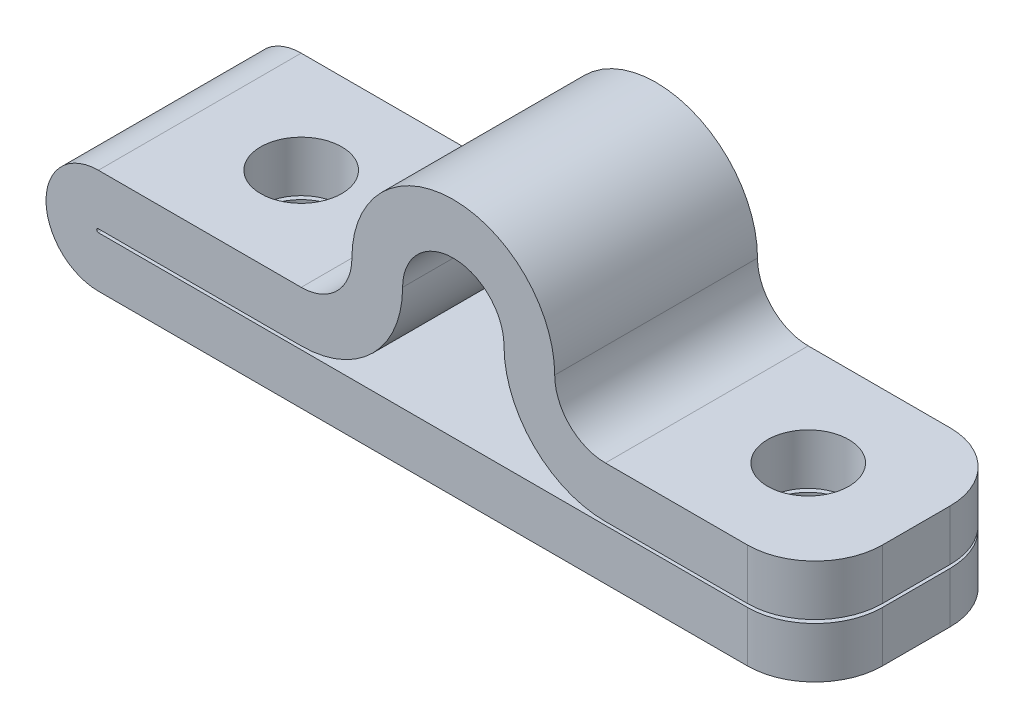
ISO-10303-21;
HEADER;
FILE_DESCRIPTION(('STEP AP214'),'2;1');
FILE_NAME('part.step','',(''),(''),'','','');
FILE_SCHEMA(('AUTOMOTIVE_DESIGN { 1 0 10303 214 1 1 1 1 }'));
ENDSEC;
DATA;
#1=APPLICATION_CONTEXT('core data for automotive mechanical design processes');
#2=APPLICATION_PROTOCOL_DEFINITION('international standard','automotive_design',2000,#1);
#3=PRODUCT_CONTEXT('',#1,'mechanical');
#4=PRODUCT('Part','Part','',(#3));
#5=PRODUCT_RELATED_PRODUCT_CATEGORY('part','',(#4));
#6=PRODUCT_DEFINITION_FORMATION('','',#4);
#7=PRODUCT_DEFINITION_CONTEXT('part definition',#1,'design');
#8=PRODUCT_DEFINITION('design','',#6,#7);
#9=PRODUCT_DEFINITION_SHAPE('','',#8);
#10=(LENGTH_UNIT() NAMED_UNIT(*) SI_UNIT(.MILLI.,.METRE.));
#11=(NAMED_UNIT(*) PLANE_ANGLE_UNIT() SI_UNIT($,.RADIAN.));
#12=(NAMED_UNIT(*) SI_UNIT($,.STERADIAN.) SOLID_ANGLE_UNIT());
#13=UNCERTAINTY_MEASURE_WITH_UNIT(LENGTH_MEASURE(1.E-05),#10,'distance_accuracy_value','');
#14=(GEOMETRIC_REPRESENTATION_CONTEXT(3) GLOBAL_UNCERTAINTY_ASSIGNED_CONTEXT((#13)) GLOBAL_UNIT_ASSIGNED_CONTEXT((#10,
#11,#12)) REPRESENTATION_CONTEXT('',''));
#15=CARTESIAN_POINT('',(0.,0.,0.));
#16=DIRECTION('',(0.,0.,1.));
#17=DIRECTION('',(1.,0.,0.));
#18=AXIS2_PLACEMENT_3D('',#15,#16,#17);
#19=CARTESIAN_POINT('',(4.5,4.6,3.));
#20=DIRECTION('',(0.,0.,-1.));
#21=DIRECTION('',(-1.,0.,0.));
#22=AXIS2_PLACEMENT_3D('',#19,#20,#21);
#23=CYLINDRICAL_SURFACE('',#22,1.5);
#24=CARTESIAN_POINT('',(4.5,4.6,-3.));
#25=DIRECTION('',(0.,0.,1.));
#26=DIRECTION('',(1.,0.,0.));
#27=AXIS2_PLACEMENT_3D('',#24,#25,#26);
#28=CIRCLE('',#27,1.5);
#29=CARTESIAN_POINT('',(4.5,3.1,-3.));
#30=VERTEX_POINT('',#29);
#31=CARTESIAN_POINT('',(3.,4.6,-3.));
#32=VERTEX_POINT('',#31);
#33=EDGE_CURVE('E206',#30,#32,#28,.F.);
#34=ORIENTED_EDGE('',*,*,#33,.T.);
#35=DIRECTION('',(0.,0.,-1.));
#36=VECTOR('',#35,1.);
#37=CARTESIAN_POINT('',(3.,4.6,3.));
#38=LINE('',#37,#36);
#39=CARTESIAN_POINT('',(3.,4.6,3.));
#40=VERTEX_POINT('',#39);
#41=EDGE_CURVE('E187',#40,#32,#38,.T.);
#42=ORIENTED_EDGE('',*,*,#41,.F.);
#43=CARTESIAN_POINT('',(4.5,4.6,3.));
#44=DIRECTION('',(0.,0.,1.));
#45=DIRECTION('',(1.,0.,0.));
#46=AXIS2_PLACEMENT_3D('',#43,#44,#45);
#47=CIRCLE('',#46,1.5);
#48=CARTESIAN_POINT('',(4.5,3.1,3.));
#49=VERTEX_POINT('',#48);
#50=EDGE_CURVE('E194',#49,#40,#47,.F.);
#51=ORIENTED_EDGE('',*,*,#50,.F.);
#52=DIRECTION('',(0.,0.,-1.));
#53=VECTOR('',#52,1.);
#54=CARTESIAN_POINT('',(4.5,3.1,3.));
#55=LINE('',#54,#53);
#56=EDGE_CURVE('E278',#49,#30,#55,.T.);
#57=ORIENTED_EDGE('',*,*,#56,.T.);
#58=EDGE_LOOP('',(#34,#42,#51,#57));
#59=FACE_BOUND('',#58,.T.);
#60=ADVANCED_FACE('F43',(#59),#23,.F.);
#61=CARTESIAN_POINT('',(0.,4.6,3.));
#62=DIRECTION('',(0.,0.,-1.));
#63=DIRECTION('',(-1.,0.,0.));
#64=AXIS2_PLACEMENT_3D('',#61,#62,#63);
#65=CYLINDRICAL_SURFACE('',#64,3.);
#66=CARTESIAN_POINT('',(0.,4.6,-3.));
#67=DIRECTION('',(0.,0.,1.));
#68=DIRECTION('',(1.,0.,0.));
#69=AXIS2_PLACEMENT_3D('',#66,#67,#68);
#70=CIRCLE('',#69,3.);
#71=CARTESIAN_POINT('',(-3.,4.6,-3.));
#72=VERTEX_POINT('',#71);
#73=EDGE_CURVE('E280',#32,#72,#70,.T.);
#74=ORIENTED_EDGE('',*,*,#73,.T.);
#75=DIRECTION('',(0.,0.,-1.));
#76=VECTOR('',#75,1.);
#77=CARTESIAN_POINT('',(-3.,4.6,3.));
#78=LINE('',#77,#76);
#79=CARTESIAN_POINT('',(-3.,4.6,3.));
#80=VERTEX_POINT('',#79);
#81=EDGE_CURVE('E189',#80,#72,#78,.T.);
#82=ORIENTED_EDGE('',*,*,#81,.F.);
#83=CARTESIAN_POINT('',(0.,4.6,3.));
#84=DIRECTION('',(0.,0.,1.));
#85=DIRECTION('',(1.,0.,0.));
#86=AXIS2_PLACEMENT_3D('',#83,#84,#85);
#87=CIRCLE('',#86,3.);
#88=EDGE_CURVE('E182',#40,#80,#87,.T.);
#89=ORIENTED_EDGE('',*,*,#88,.F.);
#90=ORIENTED_EDGE('',*,*,#41,.T.);
#91=EDGE_LOOP('',(#74,#82,#89,#90));
#92=FACE_BOUND('',#91,.T.);
#93=ADVANCED_FACE('F185',(#92),#65,.T.);
#94=CARTESIAN_POINT('',(-4.5,4.6,3.));
#95=DIRECTION('',(0.,0.,-1.));
#96=DIRECTION('',(-1.,0.,0.));
#97=AXIS2_PLACEMENT_3D('',#94,#95,#96);
#98=CYLINDRICAL_SURFACE('',#97,1.5);
#99=CARTESIAN_POINT('',(-4.5,4.6,-3.));
#100=DIRECTION('',(0.,0.,1.));
#101=DIRECTION('',(1.,0.,0.));
#102=AXIS2_PLACEMENT_3D('',#99,#100,#101);
#103=CIRCLE('',#102,1.5);
#104=CARTESIAN_POINT('',(-4.5,3.1,-3.));
#105=VERTEX_POINT('',#104);
#106=EDGE_CURVE('E283',#105,#72,#103,.T.);
#107=ORIENTED_EDGE('',*,*,#106,.F.);
#108=DIRECTION('',(0.,0.,-1.));
#109=VECTOR('',#108,1.);
#110=CARTESIAN_POINT('',(-4.5,3.1,3.));
#111=LINE('',#110,#109);
#112=CARTESIAN_POINT('',(-4.5,3.1,3.));
#113=VERTEX_POINT('',#112);
#114=EDGE_CURVE('E211',#113,#105,#111,.T.);
#115=ORIENTED_EDGE('',*,*,#114,.F.);
#116=CARTESIAN_POINT('',(-4.5,4.6,3.));
#117=DIRECTION('',(0.,0.,1.));
#118=DIRECTION('',(1.,0.,0.));
#119=AXIS2_PLACEMENT_3D('',#116,#117,#118);
#120=CIRCLE('',#119,1.5);
#121=EDGE_CURVE('E193',#113,#80,#120,.T.);
#122=ORIENTED_EDGE('',*,*,#121,.T.);
#123=ORIENTED_EDGE('',*,*,#81,.T.);
#124=EDGE_LOOP('',(#107,#115,#122,#123));
#125=FACE_BOUND('',#124,.T.);
#126=ADVANCED_FACE('F350',(#125),#98,.F.);
#127=CARTESIAN_POINT('',(0.,3.1,3.));
#128=DIRECTION('',(0.,1.,0.));
#129=DIRECTION('',(0.,0.,1.));
#130=AXIS2_PLACEMENT_3D('',#127,#128,#129);
#131=PLANE('',#130);
#132=CARTESIAN_POINT('',(-7.5,3.1,0.));
#133=DIRECTION('',(0.,1.,0.));
#134=DIRECTION('',(0.,0.,1.));
#135=AXIS2_PLACEMENT_3D('',#132,#133,#134);
#136=CIRCLE('',#135,1.19999999999999);
#137=CARTESIAN_POINT('',(-7.5,3.1,1.19999999999999));
#138=VERTEX_POINT('',#137);
#139=EDGE_CURVE('E382',#138,#138,#136,.T.);
#140=ORIENTED_EDGE('',*,*,#139,.F.);
#141=EDGE_LOOP('',(#140));
#142=FACE_BOUND('',#141,.T.);
#143=DIRECTION('',(1.,0.,0.));
#144=VECTOR('',#143,1.);
#145=CARTESIAN_POINT('',(0.,3.1,-3.));
#146=LINE('',#145,#144);
#147=CARTESIAN_POINT('',(-10.5,3.1,-3.));
#148=VERTEX_POINT('',#147);
#149=EDGE_CURVE('E286',#148,#105,#146,.T.);
#150=ORIENTED_EDGE('',*,*,#149,.F.);
#151=DIRECTION('',(0.,0.,-1.));
#152=VECTOR('',#151,1.);
#153=CARTESIAN_POINT('',(-10.5,3.1,3.));
#154=LINE('',#153,#152);
#155=CARTESIAN_POINT('',(-10.5,3.1,3.));
#156=VERTEX_POINT('',#155);
#157=EDGE_CURVE('E341',#156,#148,#154,.T.);
#158=ORIENTED_EDGE('',*,*,#157,.F.);
#159=DIRECTION('',(1.,0.,0.));
#160=VECTOR('',#159,1.);
#161=CARTESIAN_POINT('',(0.,3.1,3.));
#162=LINE('',#161,#160);
#163=EDGE_CURVE('E348',#156,#113,#162,.T.);
#164=ORIENTED_EDGE('',*,*,#163,.T.);
#165=ORIENTED_EDGE('',*,*,#114,.T.);
#166=EDGE_LOOP('',(#150,#158,#164,#165));
#167=FACE_BOUND('',#166,.T.);
#168=ADVANCED_FACE('F346',(#142,#167),#131,.T.);
#169=CARTESIAN_POINT('',(-10.5,1.55,3.));
#170=DIRECTION('',(0.,0.,-1.));
#171=DIRECTION('',(-1.,0.,0.));
#172=AXIS2_PLACEMENT_3D('',#169,#170,#171);
#173=CYLINDRICAL_SURFACE('',#172,1.55);
#174=CARTESIAN_POINT('',(-10.5,1.55,-3.));
#175=DIRECTION('',(0.,0.,1.));
#176=DIRECTION('',(1.,0.,0.));
#177=AXIS2_PLACEMENT_3D('',#174,#175,#176);
#178=CIRCLE('',#177,1.55);
#179=CARTESIAN_POINT('',(-10.5,0.,-3.));
#180=VERTEX_POINT('',#179);
#181=EDGE_CURVE('E289',#180,#148,#178,.F.);
#182=ORIENTED_EDGE('',*,*,#181,.F.);
#183=DIRECTION('',(0.,0.,-1.));
#184=VECTOR('',#183,1.);
#185=CARTESIAN_POINT('',(-10.5,0.,3.));
#186=LINE('',#185,#184);
#187=CARTESIAN_POINT('',(-10.5,0.,3.));
#188=VERTEX_POINT('',#187);
#189=EDGE_CURVE('E339',#188,#180,#186,.T.);
#190=ORIENTED_EDGE('',*,*,#189,.F.);
#191=CARTESIAN_POINT('',(-10.5,1.55,3.));
#192=DIRECTION('',(0.,0.,1.));
#193=DIRECTION('',(1.,0.,0.));
#194=AXIS2_PLACEMENT_3D('',#191,#192,#193);
#195=CIRCLE('',#194,1.55);
#196=EDGE_CURVE('E261',#188,#156,#195,.F.);
#197=ORIENTED_EDGE('',*,*,#196,.T.);
#198=ORIENTED_EDGE('',*,*,#157,.T.);
#199=EDGE_LOOP('',(#182,#190,#197,#198));
#200=FACE_BOUND('',#199,.T.);
#201=ADVANCED_FACE('F357',(#200),#173,.T.);
#202=CARTESIAN_POINT('',(0.,0.,3.));
#203=DIRECTION('',(0.,1.,0.));
#204=DIRECTION('',(0.,0.,1.));
#205=AXIS2_PLACEMENT_3D('',#202,#203,#204);
#206=PLANE('',#205);
#207=CARTESIAN_POINT('',(-7.5,0.,0.));
#208=DIRECTION('',(0.,1.,0.));
#209=DIRECTION('',(0.,0.,1.));
#210=AXIS2_PLACEMENT_3D('',#207,#208,#209);
#211=CIRCLE('',#210,1.2);
#212=CARTESIAN_POINT('',(-7.5,0.,1.2));
#213=VERTEX_POINT('',#212);
#214=EDGE_CURVE('E379',#213,#213,#211,.T.);
#215=ORIENTED_EDGE('',*,*,#214,.T.);
#216=EDGE_LOOP('',(#215));
#217=FACE_BOUND('',#216,.T.);
#218=CARTESIAN_POINT('',(7.5,0.,0.));
#219=DIRECTION('',(0.,1.,0.));
#220=DIRECTION('',(0.,0.,1.));
#221=AXIS2_PLACEMENT_3D('',#218,#219,#220);
#222=CIRCLE('',#221,1.2);
#223=CARTESIAN_POINT('',(7.5,0.,1.2));
#224=VERTEX_POINT('',#223);
#225=EDGE_CURVE('E367',#224,#224,#222,.T.);
#226=ORIENTED_EDGE('',*,*,#225,.T.);
#227=EDGE_LOOP('',(#226));
#228=FACE_BOUND('',#227,.T.);
#229=DIRECTION('',(1.,0.,0.));
#230=VECTOR('',#229,1.);
#231=CARTESIAN_POINT('',(0.,0.,-3.));
#232=LINE('',#231,#230);
#233=CARTESIAN_POINT('',(8.7,0.,-3.));
#234=VERTEX_POINT('',#233);
#235=EDGE_CURVE('E292',#180,#234,#232,.T.);
#236=ORIENTED_EDGE('',*,*,#235,.T.);
#237=CARTESIAN_POINT('',(8.7,0.,-1.));
#238=DIRECTION('',(0.,1.,0.));
#239=DIRECTION('',(0.,0.,1.));
#240=AXIS2_PLACEMENT_3D('',#237,#238,#239);
#241=CIRCLE('',#240,2.);
#242=CARTESIAN_POINT('',(10.7,0.,-1.));
#243=VERTEX_POINT('',#242);
#244=EDGE_CURVE('E227',#234,#243,#241,.F.);
#245=ORIENTED_EDGE('',*,*,#244,.T.);
#246=DIRECTION('',(0.,0.,-1.));
#247=VECTOR('',#246,1.);
#248=CARTESIAN_POINT('',(10.7,0.,3.));
#249=LINE('',#248,#247);
#250=CARTESIAN_POINT('',(10.7,0.,1.));
#251=VERTEX_POINT('',#250);
#252=EDGE_CURVE('E336',#251,#243,#249,.T.);
#253=ORIENTED_EDGE('',*,*,#252,.F.);
#254=CARTESIAN_POINT('',(8.7,0.,1.));
#255=DIRECTION('',(0.,1.,0.));
#256=DIRECTION('',(0.,0.,1.));
#257=AXIS2_PLACEMENT_3D('',#254,#255,#256);
#258=CIRCLE('',#257,2.);
#259=CARTESIAN_POINT('',(8.7,0.,3.));
#260=VERTEX_POINT('',#259);
#261=EDGE_CURVE('E225',#251,#260,#258,.F.);
#262=ORIENTED_EDGE('',*,*,#261,.T.);
#263=DIRECTION('',(1.,0.,0.));
#264=VECTOR('',#263,1.);
#265=CARTESIAN_POINT('',(0.,0.,3.));
#266=LINE('',#265,#264);
#267=EDGE_CURVE('E247',#188,#260,#266,.T.);
#268=ORIENTED_EDGE('',*,*,#267,.F.);
#269=ORIENTED_EDGE('',*,*,#189,.T.);
#270=EDGE_LOOP('',(#236,#245,#253,#262,#268,#269));
#271=FACE_BOUND('',#270,.T.);
#272=ADVANCED_FACE('F396',(#217,#228,#271),#206,.F.);
#273=CARTESIAN_POINT('',(10.7,0.,3.));
#274=DIRECTION('',(-1.,0.,0.));
#275=DIRECTION('',(0.,0.,1.));
#276=AXIS2_PLACEMENT_3D('',#273,#274,#275);
#277=PLANE('',#276);
#278=ORIENTED_EDGE('',*,*,#252,.T.);
#279=DIRECTION('',(0.,1.,0.));
#280=VECTOR('',#279,1.);
#281=CARTESIAN_POINT('',(10.7,0.,-1.));
#282=LINE('',#281,#280);
#283=CARTESIAN_POINT('',(10.7,1.5,-1.));
#284=VERTEX_POINT('',#283);
#285=EDGE_CURVE('E209',#243,#284,#282,.T.);
#286=ORIENTED_EDGE('',*,*,#285,.T.);
#287=DIRECTION('',(0.,0.,-1.));
#288=VECTOR('',#287,1.);
#289=CARTESIAN_POINT('',(10.7,1.5,3.));
#290=LINE('',#289,#288);
#291=CARTESIAN_POINT('',(10.7,1.5,1.));
#292=VERTEX_POINT('',#291);
#293=EDGE_CURVE('E334',#292,#284,#290,.T.);
#294=ORIENTED_EDGE('',*,*,#293,.F.);
#295=DIRECTION('',(0.,1.,0.));
#296=VECTOR('',#295,1.);
#297=CARTESIAN_POINT('',(10.7,0.,1.));
#298=LINE('',#297,#296);
#299=EDGE_CURVE('E207',#292,#251,#298,.F.);
#300=ORIENTED_EDGE('',*,*,#299,.T.);
#301=EDGE_LOOP('',(#278,#286,#294,#300));
#302=FACE_BOUND('',#301,.T.);
#303=ADVANCED_FACE('F463',(#302),#277,.F.);
#304=CARTESIAN_POINT('',(0.,1.5,3.));
#305=DIRECTION('',(0.,-1.,0.));
#306=DIRECTION('',(1.,0.,0.));
#307=AXIS2_PLACEMENT_3D('',#304,#305,#306);
#308=PLANE('',#307);
#309=CARTESIAN_POINT('',(-7.5,1.5,0.));
#310=DIRECTION('',(0.,-1.,0.));
#311=DIRECTION('',(1.,0.,0.));
#312=AXIS2_PLACEMENT_3D('',#309,#310,#311);
#313=CIRCLE('',#312,1.19999999999999);
#314=CARTESIAN_POINT('',(-6.30000000000001,1.5,0.));
#315=VERTEX_POINT('',#314);
#316=EDGE_CURVE('E376',#315,#315,#313,.T.);
#317=ORIENTED_EDGE('',*,*,#316,.T.);
#318=EDGE_LOOP('',(#317));
#319=FACE_BOUND('',#318,.T.);
#320=CARTESIAN_POINT('',(7.5,1.5,0.));
#321=DIRECTION('',(0.,-1.,0.));
#322=DIRECTION('',(1.,0.,0.));
#323=AXIS2_PLACEMENT_3D('',#320,#321,#322);
#324=CIRCLE('',#323,1.19999999999999);
#325=CARTESIAN_POINT('',(8.7,1.5,0.));
#326=VERTEX_POINT('',#325);
#327=EDGE_CURVE('E364',#326,#326,#324,.T.);
#328=ORIENTED_EDGE('',*,*,#327,.T.);
#329=EDGE_LOOP('',(#328));
#330=FACE_BOUND('',#329,.T.);
#331=ORIENTED_EDGE('',*,*,#293,.T.);
#332=CARTESIAN_POINT('',(8.7,1.5,-1.));
#333=DIRECTION('',(0.,-1.,0.));
#334=DIRECTION('',(1.,0.,0.));
#335=AXIS2_PLACEMENT_3D('',#332,#333,#334);
#336=CIRCLE('',#335,2.);
#337=CARTESIAN_POINT('',(8.7,1.5,-3.));
#338=VERTEX_POINT('',#337);
#339=EDGE_CURVE('E219',#284,#338,#336,.F.);
#340=ORIENTED_EDGE('',*,*,#339,.T.);
#341=DIRECTION('',(-1.,0.,0.));
#342=VECTOR('',#341,1.);
#343=CARTESIAN_POINT('',(0.,1.5,-3.));
#344=LINE('',#343,#342);
#345=CARTESIAN_POINT('',(-10.5,1.5,-3.));
#346=VERTEX_POINT('',#345);
#347=EDGE_CURVE('E295',#338,#346,#344,.T.);
#348=ORIENTED_EDGE('',*,*,#347,.T.);
#349=DIRECTION('',(0.,0.,-1.));
#350=VECTOR('',#349,1.);
#351=CARTESIAN_POINT('',(-10.5,1.5,3.));
#352=LINE('',#351,#350);
#353=CARTESIAN_POINT('',(-10.5,1.5,3.));
#354=VERTEX_POINT('',#353);
#355=EDGE_CURVE('E255',#354,#346,#352,.T.);
#356=ORIENTED_EDGE('',*,*,#355,.F.);
#357=DIRECTION('',(-1.,0.,0.));
#358=VECTOR('',#357,1.);
#359=CARTESIAN_POINT('',(0.,1.5,3.));
#360=LINE('',#359,#358);
#361=CARTESIAN_POINT('',(8.7,1.5,3.));
#362=VERTEX_POINT('',#361);
#363=EDGE_CURVE('E243',#362,#354,#360,.T.);
#364=ORIENTED_EDGE('',*,*,#363,.F.);
#365=CARTESIAN_POINT('',(8.7,1.5,1.));
#366=DIRECTION('',(0.,-1.,0.));
#367=DIRECTION('',(1.,0.,0.));
#368=AXIS2_PLACEMENT_3D('',#365,#366,#367);
#369=CIRCLE('',#368,2.);
#370=EDGE_CURVE('E217',#362,#292,#369,.F.);
#371=ORIENTED_EDGE('',*,*,#370,.T.);
#372=EDGE_LOOP('',(#331,#340,#348,#356,#364,#371));
#373=FACE_BOUND('',#372,.T.);
#374=ADVANCED_FACE('F252',(#319,#330,#373),#308,.F.);
#375=CARTESIAN_POINT('',(-10.5,1.55,3.));
#376=DIRECTION('',(0.,0.,-1.));
#377=DIRECTION('',(-1.,0.,0.));
#378=AXIS2_PLACEMENT_3D('',#375,#376,#377);
#379=CYLINDRICAL_SURFACE('',#378,0.050000000000001);
#380=CARTESIAN_POINT('',(-10.5,1.55,-3.));
#381=DIRECTION('',(0.,0.,1.));
#382=DIRECTION('',(1.,0.,0.));
#383=AXIS2_PLACEMENT_3D('',#380,#381,#382);
#384=CIRCLE('',#383,0.050000000000001);
#385=CARTESIAN_POINT('',(-10.5,1.6,-3.));
#386=VERTEX_POINT('',#385);
#387=EDGE_CURVE('E297',#346,#386,#384,.F.);
#388=ORIENTED_EDGE('',*,*,#387,.T.);
#389=DIRECTION('',(0.,0.,-1.));
#390=VECTOR('',#389,1.);
#391=CARTESIAN_POINT('',(-10.5,1.6,3.));
#392=LINE('',#391,#390);
#393=CARTESIAN_POINT('',(-10.5,1.6,3.));
#394=VERTEX_POINT('',#393);
#395=EDGE_CURVE('E330',#394,#386,#392,.T.);
#396=ORIENTED_EDGE('',*,*,#395,.F.);
#397=CARTESIAN_POINT('',(-10.5,1.55,3.));
#398=DIRECTION('',(0.,0.,1.));
#399=DIRECTION('',(1.,0.,0.));
#400=AXIS2_PLACEMENT_3D('',#397,#398,#399);
#401=CIRCLE('',#400,0.050000000000001);
#402=EDGE_CURVE('E257',#354,#394,#401,.F.);
#403=ORIENTED_EDGE('',*,*,#402,.F.);
#404=ORIENTED_EDGE('',*,*,#355,.T.);
#405=EDGE_LOOP('',(#388,#396,#403,#404));
#406=FACE_BOUND('',#405,.T.);
#407=ADVANCED_FACE('F456',(#406),#379,.F.);
#408=CARTESIAN_POINT('',(0.,1.6,3.));
#409=DIRECTION('',(0.,1.,0.));
#410=DIRECTION('',(0.,0.,1.));
#411=AXIS2_PLACEMENT_3D('',#408,#409,#410);
#412=PLANE('',#411);
#413=CARTESIAN_POINT('',(-7.5,1.6,0.));
#414=DIRECTION('',(0.,1.,0.));
#415=DIRECTION('',(0.,0.,1.));
#416=AXIS2_PLACEMENT_3D('',#413,#414,#415);
#417=CIRCLE('',#416,1.19999999999999);
#418=CARTESIAN_POINT('',(-7.5,1.6,1.19999999999999));
#419=VERTEX_POINT('',#418);
#420=EDGE_CURVE('E373',#419,#419,#417,.T.);
#421=ORIENTED_EDGE('',*,*,#420,.T.);
#422=EDGE_LOOP('',(#421));
#423=FACE_BOUND('',#422,.T.);
#424=DIRECTION('',(1.,0.,0.));
#425=VECTOR('',#424,1.);
#426=CARTESIAN_POINT('',(0.,1.6,-3.));
#427=LINE('',#426,#425);
#428=CARTESIAN_POINT('',(-4.5,1.6,-3.));
#429=VERTEX_POINT('',#428);
#430=EDGE_CURVE('E299',#386,#429,#427,.T.);
#431=ORIENTED_EDGE('',*,*,#430,.T.);
#432=DIRECTION('',(0.,0.,-1.));
#433=VECTOR('',#432,1.);
#434=CARTESIAN_POINT('',(-4.5,1.6,3.));
#435=LINE('',#434,#433);
#436=CARTESIAN_POINT('',(-4.5,1.6,3.));
#437=VERTEX_POINT('',#436);
#438=EDGE_CURVE('E328',#437,#429,#435,.T.);
#439=ORIENTED_EDGE('',*,*,#438,.F.);
#440=DIRECTION('',(1.,0.,0.));
#441=VECTOR('',#440,1.);
#442=CARTESIAN_POINT('',(0.,1.6,3.));
#443=LINE('',#442,#441);
#444=EDGE_CURVE('E259',#394,#437,#443,.T.);
#445=ORIENTED_EDGE('',*,*,#444,.F.);
#446=ORIENTED_EDGE('',*,*,#395,.T.);
#447=EDGE_LOOP('',(#431,#439,#445,#446));
#448=FACE_BOUND('',#447,.T.);
#449=ADVANCED_FACE('F453',(#423,#448),#412,.F.);
#450=CARTESIAN_POINT('',(-4.5,4.6,3.));
#451=DIRECTION('',(0.,0.,-1.));
#452=DIRECTION('',(-1.,0.,0.));
#453=AXIS2_PLACEMENT_3D('',#450,#451,#452);
#454=CYLINDRICAL_SURFACE('',#453,3.);
#455=CARTESIAN_POINT('',(-4.5,4.6,-3.));
#456=DIRECTION('',(0.,0.,1.));
#457=DIRECTION('',(1.,0.,0.));
#458=AXIS2_PLACEMENT_3D('',#455,#456,#457);
#459=CIRCLE('',#458,3.);
#460=CARTESIAN_POINT('',(-1.5,4.6,-3.));
#461=VERTEX_POINT('',#460);
#462=EDGE_CURVE('E302',#461,#429,#459,.F.);
#463=ORIENTED_EDGE('',*,*,#462,.F.);
#464=DIRECTION('',(0.,0.,-1.));
#465=VECTOR('',#464,1.);
#466=CARTESIAN_POINT('',(-1.5,4.6,3.));
#467=LINE('',#466,#465);
#468=CARTESIAN_POINT('',(-1.5,4.6,3.));
#469=VERTEX_POINT('',#468);
#470=EDGE_CURVE('E326',#469,#461,#467,.T.);
#471=ORIENTED_EDGE('',*,*,#470,.F.);
#472=CARTESIAN_POINT('',(-4.5,4.6,3.));
#473=DIRECTION('',(0.,0.,1.));
#474=DIRECTION('',(1.,0.,0.));
#475=AXIS2_PLACEMENT_3D('',#472,#473,#474);
#476=CIRCLE('',#475,3.);
#477=EDGE_CURVE('E266',#469,#437,#476,.F.);
#478=ORIENTED_EDGE('',*,*,#477,.T.);
#479=ORIENTED_EDGE('',*,*,#438,.T.);
#480=EDGE_LOOP('',(#463,#471,#478,#479));
#481=FACE_BOUND('',#480,.T.);
#482=ADVANCED_FACE('F449',(#481),#454,.T.);
#483=CARTESIAN_POINT('',(0.,4.6,3.));
#484=DIRECTION('',(0.,0.,-1.));
#485=DIRECTION('',(-1.,0.,0.));
#486=AXIS2_PLACEMENT_3D('',#483,#484,#485);
#487=CYLINDRICAL_SURFACE('',#486,1.5);
#488=CARTESIAN_POINT('',(0.,4.6,-3.));
#489=DIRECTION('',(0.,0.,1.));
#490=DIRECTION('',(1.,0.,0.));
#491=AXIS2_PLACEMENT_3D('',#488,#489,#490);
#492=CIRCLE('',#491,1.5);
#493=CARTESIAN_POINT('',(1.5,4.6,-3.));
#494=VERTEX_POINT('',#493);
#495=EDGE_CURVE('E305',#494,#461,#492,.T.);
#496=ORIENTED_EDGE('',*,*,#495,.F.);
#497=DIRECTION('',(0.,0.,-1.));
#498=VECTOR('',#497,1.);
#499=CARTESIAN_POINT('',(1.5,4.6,3.));
#500=LINE('',#499,#498);
#501=CARTESIAN_POINT('',(1.5,4.6,3.));
#502=VERTEX_POINT('',#501);
#503=EDGE_CURVE('E324',#502,#494,#500,.T.);
#504=ORIENTED_EDGE('',*,*,#503,.F.);
#505=CARTESIAN_POINT('',(0.,4.6,3.));
#506=DIRECTION('',(0.,0.,1.));
#507=DIRECTION('',(1.,0.,0.));
#508=AXIS2_PLACEMENT_3D('',#505,#506,#507);
#509=CIRCLE('',#508,1.5);
#510=EDGE_CURVE('E269',#502,#469,#509,.T.);
#511=ORIENTED_EDGE('',*,*,#510,.T.);
#512=ORIENTED_EDGE('',*,*,#470,.T.);
#513=EDGE_LOOP('',(#496,#504,#511,#512));
#514=FACE_BOUND('',#513,.T.);
#515=ADVANCED_FACE('F445',(#514),#487,.F.);
#516=CARTESIAN_POINT('',(4.5,4.6,3.));
#517=DIRECTION('',(0.,0.,-1.));
#518=DIRECTION('',(-1.,0.,0.));
#519=AXIS2_PLACEMENT_3D('',#516,#517,#518);
#520=CYLINDRICAL_SURFACE('',#519,3.);
#521=CARTESIAN_POINT('',(4.5,4.6,-3.));
#522=DIRECTION('',(0.,0.,1.));
#523=DIRECTION('',(1.,0.,0.));
#524=AXIS2_PLACEMENT_3D('',#521,#522,#523);
#525=CIRCLE('',#524,3.);
#526=CARTESIAN_POINT('',(4.5,1.6,-3.));
#527=VERTEX_POINT('',#526);
#528=EDGE_CURVE('E308',#527,#494,#525,.F.);
#529=ORIENTED_EDGE('',*,*,#528,.F.);
#530=DIRECTION('',(0.,0.,-1.));
#531=VECTOR('',#530,1.);
#532=CARTESIAN_POINT('',(4.5,1.6,3.));
#533=LINE('',#532,#531);
#534=CARTESIAN_POINT('',(4.5,1.6,3.));
#535=VERTEX_POINT('',#534);
#536=EDGE_CURVE('E322',#535,#527,#533,.T.);
#537=ORIENTED_EDGE('',*,*,#536,.F.);
#538=CARTESIAN_POINT('',(4.5,4.6,3.));
#539=DIRECTION('',(0.,0.,1.));
#540=DIRECTION('',(1.,0.,0.));
#541=AXIS2_PLACEMENT_3D('',#538,#539,#540);
#542=CIRCLE('',#541,3.);
#543=EDGE_CURVE('E272',#535,#502,#542,.F.);
#544=ORIENTED_EDGE('',*,*,#543,.T.);
#545=ORIENTED_EDGE('',*,*,#503,.T.);
#546=EDGE_LOOP('',(#529,#537,#544,#545));
#547=FACE_BOUND('',#546,.T.);
#548=ADVANCED_FACE('F439',(#547),#520,.T.);
#549=CARTESIAN_POINT('',(0.,1.6,3.));
#550=DIRECTION('',(0.,1.,0.));
#551=DIRECTION('',(-1.,0.,0.));
#552=AXIS2_PLACEMENT_3D('',#549,#550,#551);
#553=PLANE('',#552);
#554=CARTESIAN_POINT('',(7.5,1.6,0.));
#555=DIRECTION('',(0.,1.,0.));
#556=DIRECTION('',(-1.,0.,0.));
#557=AXIS2_PLACEMENT_3D('',#554,#555,#556);
#558=CIRCLE('',#557,1.19999999999999);
#559=CARTESIAN_POINT('',(6.30000000000001,1.6,0.));
#560=VERTEX_POINT('',#559);
#561=EDGE_CURVE('E281',#560,#560,#558,.T.);
#562=ORIENTED_EDGE('',*,*,#561,.T.);
#563=EDGE_LOOP('',(#562));
#564=FACE_BOUND('',#563,.T.);
#565=DIRECTION('',(1.,0.,0.));
#566=VECTOR('',#565,1.);
#567=CARTESIAN_POINT('',(0.,1.6,-3.));
#568=LINE('',#567,#566);
#569=CARTESIAN_POINT('',(8.7,1.6,-3.));
#570=VERTEX_POINT('',#569);
#571=EDGE_CURVE('E311',#527,#570,#568,.T.);
#572=ORIENTED_EDGE('',*,*,#571,.T.);
#573=CARTESIAN_POINT('',(8.7,1.6,-1.));
#574=DIRECTION('',(0.,1.,0.));
#575=DIRECTION('',(-1.,0.,0.));
#576=AXIS2_PLACEMENT_3D('',#573,#574,#575);
#577=CIRCLE('',#576,2.);
#578=CARTESIAN_POINT('',(10.7,1.6,-1.));
#579=VERTEX_POINT('',#578);
#580=EDGE_CURVE('E238',#570,#579,#577,.F.);
#581=ORIENTED_EDGE('',*,*,#580,.T.);
#582=DIRECTION('',(0.,0.,-1.));
#583=VECTOR('',#582,1.);
#584=CARTESIAN_POINT('',(10.7,1.6,3.));
#585=LINE('',#584,#583);
#586=CARTESIAN_POINT('',(10.7,1.6,1.));
#587=VERTEX_POINT('',#586);
#588=EDGE_CURVE('E319',#587,#579,#585,.T.);
#589=ORIENTED_EDGE('',*,*,#588,.F.);
#590=CARTESIAN_POINT('',(8.7,1.6,1.));
#591=DIRECTION('',(0.,1.,0.));
#592=DIRECTION('',(-1.,0.,0.));
#593=AXIS2_PLACEMENT_3D('',#590,#591,#592);
#594=CIRCLE('',#593,2.);
#595=CARTESIAN_POINT('',(8.7,1.6,3.));
#596=VERTEX_POINT('',#595);
#597=EDGE_CURVE('E58',#587,#596,#594,.F.);
#598=ORIENTED_EDGE('',*,*,#597,.T.);
#599=DIRECTION('',(1.,0.,0.));
#600=VECTOR('',#599,1.);
#601=CARTESIAN_POINT('',(0.,1.6,3.));
#602=LINE('',#601,#600);
#603=EDGE_CURVE('E275',#535,#596,#602,.T.);
#604=ORIENTED_EDGE('',*,*,#603,.F.);
#605=ORIENTED_EDGE('',*,*,#536,.T.);
#606=EDGE_LOOP('',(#572,#581,#589,#598,#604,#605));
#607=FACE_BOUND('',#606,.T.);
#608=ADVANCED_FACE('F428',(#564,#607),#553,.F.);
#609=CARTESIAN_POINT('',(10.7,0.,3.));
#610=DIRECTION('',(-1.,0.,0.));
#611=DIRECTION('',(0.,0.,1.));
#612=AXIS2_PLACEMENT_3D('',#609,#610,#611);
#613=PLANE('',#612);
#614=ORIENTED_EDGE('',*,*,#588,.T.);
#615=DIRECTION('',(0.,1.,0.));
#616=VECTOR('',#615,1.);
#617=CARTESIAN_POINT('',(10.7,0.,-1.));
#618=LINE('',#617,#616);
#619=CARTESIAN_POINT('',(10.7,3.1,-1.));
#620=VERTEX_POINT('',#619);
#621=EDGE_CURVE('E231',#579,#620,#618,.T.);
#622=ORIENTED_EDGE('',*,*,#621,.T.);
#623=DIRECTION('',(0.,0.,-1.));
#624=VECTOR('',#623,1.);
#625=CARTESIAN_POINT('',(10.7,3.1,3.));
#626=LINE('',#625,#624);
#627=CARTESIAN_POINT('',(10.7,3.1,1.));
#628=VERTEX_POINT('',#627);
#629=EDGE_CURVE('E316',#628,#620,#626,.T.);
#630=ORIENTED_EDGE('',*,*,#629,.F.);
#631=DIRECTION('',(0.,1.,0.));
#632=VECTOR('',#631,1.);
#633=CARTESIAN_POINT('',(10.7,1.6,1.));
#634=LINE('',#633,#632);
#635=EDGE_CURVE('E229',#628,#587,#634,.F.);
#636=ORIENTED_EDGE('',*,*,#635,.T.);
#637=EDGE_LOOP('',(#614,#622,#630,#636));
#638=FACE_BOUND('',#637,.T.);
#639=ADVANCED_FACE('F430',(#638),#613,.F.);
#640=CARTESIAN_POINT('',(0.,3.1,3.));
#641=DIRECTION('',(0.,-1.,0.));
#642=DIRECTION('',(0.,0.,-1.));
#643=AXIS2_PLACEMENT_3D('',#640,#641,#642);
#644=PLANE('',#643);
#645=CARTESIAN_POINT('',(7.5,3.1,0.));
#646=DIRECTION('',(0.,1.,0.));
#647=DIRECTION('',(0.,0.,1.));
#648=AXIS2_PLACEMENT_3D('',#645,#646,#647);
#649=CIRCLE('',#648,1.19999999999999);
#650=CARTESIAN_POINT('',(7.5,3.1,1.19999999999999));
#651=VERTEX_POINT('',#650);
#652=EDGE_CURVE('E370',#651,#651,#649,.T.);
#653=ORIENTED_EDGE('',*,*,#652,.F.);
#654=EDGE_LOOP('',(#653));
#655=FACE_BOUND('',#654,.T.);
#656=ORIENTED_EDGE('',*,*,#629,.T.);
#657=CARTESIAN_POINT('',(8.7,3.1,-1.));
#658=DIRECTION('',(0.,-1.,0.));
#659=DIRECTION('',(0.,0.,-1.));
#660=AXIS2_PLACEMENT_3D('',#657,#658,#659);
#661=CIRCLE('',#660,2.);
#662=CARTESIAN_POINT('',(8.7,3.1,-3.));
#663=VERTEX_POINT('',#662);
#664=EDGE_CURVE('E235',#620,#663,#661,.F.);
#665=ORIENTED_EDGE('',*,*,#664,.T.);
#666=DIRECTION('',(-1.,0.,0.));
#667=VECTOR('',#666,1.);
#668=CARTESIAN_POINT('',(0.,3.1,-3.));
#669=LINE('',#668,#667);
#670=EDGE_CURVE('E203',#663,#30,#669,.T.);
#671=ORIENTED_EDGE('',*,*,#670,.T.);
#672=ORIENTED_EDGE('',*,*,#56,.F.);
#673=DIRECTION('',(-1.,0.,0.));
#674=VECTOR('',#673,1.);
#675=CARTESIAN_POINT('',(0.,3.1,3.));
#676=LINE('',#675,#674);
#677=CARTESIAN_POINT('',(8.7,3.1,3.));
#678=VERTEX_POINT('',#677);
#679=EDGE_CURVE('E199',#678,#49,#676,.T.);
#680=ORIENTED_EDGE('',*,*,#679,.F.);
#681=CARTESIAN_POINT('',(8.7,3.1,1.));
#682=DIRECTION('',(0.,-1.,0.));
#683=DIRECTION('',(0.,0.,-1.));
#684=AXIS2_PLACEMENT_3D('',#681,#682,#683);
#685=CIRCLE('',#684,2.);
#686=EDGE_CURVE('E66',#678,#628,#685,.F.);
#687=ORIENTED_EDGE('',*,*,#686,.T.);
#688=EDGE_LOOP('',(#656,#665,#671,#672,#680,#687));
#689=FACE_BOUND('',#688,.T.);
#690=ADVANCED_FACE('F421',(#655,#689),#644,.F.);
#691=CARTESIAN_POINT('',(0.,0.,3.));
#692=DIRECTION('',(0.,0.,1.));
#693=DIRECTION('',(1.,0.,0.));
#694=AXIS2_PLACEMENT_3D('',#691,#692,#693);
#695=PLANE('',#694);
#696=ORIENTED_EDGE('',*,*,#603,.T.);
#697=DIRECTION('',(0.,1.,0.));
#698=VECTOR('',#697,1.);
#699=CARTESIAN_POINT('',(8.7,3.1,3.));
#700=LINE('',#699,#698);
#701=EDGE_CURVE('E11',#596,#678,#700,.T.);
#702=ORIENTED_EDGE('',*,*,#701,.T.);
#703=ORIENTED_EDGE('',*,*,#679,.T.);
#704=ORIENTED_EDGE('',*,*,#50,.T.);
#705=ORIENTED_EDGE('',*,*,#88,.T.);
#706=ORIENTED_EDGE('',*,*,#121,.F.);
#707=ORIENTED_EDGE('',*,*,#163,.F.);
#708=ORIENTED_EDGE('',*,*,#196,.F.);
#709=ORIENTED_EDGE('',*,*,#267,.T.);
#710=DIRECTION('',(0.,1.,0.));
#711=VECTOR('',#710,1.);
#712=CARTESIAN_POINT('',(8.7,1.5,3.));
#713=LINE('',#712,#711);
#714=EDGE_CURVE('E51',#260,#362,#713,.T.);
#715=ORIENTED_EDGE('',*,*,#714,.T.);
#716=ORIENTED_EDGE('',*,*,#363,.T.);
#717=ORIENTED_EDGE('',*,*,#402,.T.);
#718=ORIENTED_EDGE('',*,*,#444,.T.);
#719=ORIENTED_EDGE('',*,*,#477,.F.);
#720=ORIENTED_EDGE('',*,*,#510,.F.);
#721=ORIENTED_EDGE('',*,*,#543,.F.);
#722=EDGE_LOOP('',(#696,#702,#703,#704,#705,#706,#707,#708,#709,#715,#716,#717,#718,#719,#720,#721));
#723=FACE_BOUND('',#722,.T.);
#724=ADVANCED_FACE('F197',(#723),#695,.T.);
#725=CARTESIAN_POINT('',(0.,0.,-3.));
#726=DIRECTION('',(0.,0.,1.));
#727=DIRECTION('',(1.,0.,0.));
#728=AXIS2_PLACEMENT_3D('',#725,#726,#727);
#729=PLANE('',#728);
#730=ORIENTED_EDGE('',*,*,#347,.F.);
#731=DIRECTION('',(0.,1.,0.));
#732=VECTOR('',#731,1.);
#733=CARTESIAN_POINT('',(8.7,0.,-3.));
#734=LINE('',#733,#732);
#735=EDGE_CURVE('E223',#338,#234,#734,.F.);
#736=ORIENTED_EDGE('',*,*,#735,.T.);
#737=ORIENTED_EDGE('',*,*,#235,.F.);
#738=ORIENTED_EDGE('',*,*,#181,.T.);
#739=ORIENTED_EDGE('',*,*,#149,.T.);
#740=ORIENTED_EDGE('',*,*,#106,.T.);
#741=ORIENTED_EDGE('',*,*,#73,.F.);
#742=ORIENTED_EDGE('',*,*,#33,.F.);
#743=ORIENTED_EDGE('',*,*,#670,.F.);
#744=DIRECTION('',(0.,1.,0.));
#745=VECTOR('',#744,1.);
#746=CARTESIAN_POINT('',(8.7,0.,-3.));
#747=LINE('',#746,#745);
#748=EDGE_CURVE('E221',#663,#570,#747,.F.);
#749=ORIENTED_EDGE('',*,*,#748,.T.);
#750=ORIENTED_EDGE('',*,*,#571,.F.);
#751=ORIENTED_EDGE('',*,*,#528,.T.);
#752=ORIENTED_EDGE('',*,*,#495,.T.);
#753=ORIENTED_EDGE('',*,*,#462,.T.);
#754=ORIENTED_EDGE('',*,*,#430,.F.);
#755=ORIENTED_EDGE('',*,*,#387,.F.);
#756=EDGE_LOOP('',(#730,#736,#737,#738,#739,#740,#741,#742,#743,#749,#750,#751,#752,#753,#754,#755));
#757=FACE_BOUND('',#756,.T.);
#758=ADVANCED_FACE('F353',(#757),#729,.F.);
#759=CARTESIAN_POINT('',(7.5,3.1,0.));
#760=DIRECTION('',(0.,1.,0.));
#761=DIRECTION('',(0.,0.,1.));
#762=AXIS2_PLACEMENT_3D('',#759,#760,#761);
#763=CYLINDRICAL_SURFACE('',#762,1.19999999999999);
#764=ORIENTED_EDGE('',*,*,#225,.F.);
#765=EDGE_LOOP('',(#764));
#766=FACE_BOUND('',#765,.T.);
#767=ORIENTED_EDGE('',*,*,#327,.F.);
#768=EDGE_LOOP('',(#767));
#769=FACE_BOUND('',#768,.T.);
#770=ADVANCED_FACE('F494',(#766,#769),#763,.F.);
#771=ORIENTED_EDGE('',*,*,#652,.T.);
#772=EDGE_LOOP('',(#771));
#773=FACE_BOUND('',#772,.T.);
#774=ORIENTED_EDGE('',*,*,#561,.F.);
#775=EDGE_LOOP('',(#774));
#776=FACE_BOUND('',#775,.T.);
#777=ADVANCED_FACE('F497',(#773,#776),#763,.F.);
#778=CARTESIAN_POINT('',(-7.5,3.1,0.));
#779=DIRECTION('',(0.,1.,0.));
#780=DIRECTION('',(0.,0.,1.));
#781=AXIS2_PLACEMENT_3D('',#778,#779,#780);
#782=CYLINDRICAL_SURFACE('',#781,1.19999999999999);
#783=ORIENTED_EDGE('',*,*,#214,.F.);
#784=EDGE_LOOP('',(#783));
#785=FACE_BOUND('',#784,.T.);
#786=ORIENTED_EDGE('',*,*,#316,.F.);
#787=EDGE_LOOP('',(#786));
#788=FACE_BOUND('',#787,.T.);
#789=ADVANCED_FACE('F504',(#785,#788),#782,.F.);
#790=ORIENTED_EDGE('',*,*,#139,.T.);
#791=EDGE_LOOP('',(#790));
#792=FACE_BOUND('',#791,.T.);
#793=ORIENTED_EDGE('',*,*,#420,.F.);
#794=EDGE_LOOP('',(#793));
#795=FACE_BOUND('',#794,.T.);
#796=ADVANCED_FACE('F386',(#792,#795),#782,.F.);
#797=CARTESIAN_POINT('',(8.7,0.,-1.));
#798=DIRECTION('',(0.,1.,0.));
#799=DIRECTION('',(0.,0.,1.));
#800=AXIS2_PLACEMENT_3D('',#797,#798,#799);
#801=CYLINDRICAL_SURFACE('',#800,2.);
#802=ORIENTED_EDGE('',*,*,#244,.F.);
#803=ORIENTED_EDGE('',*,*,#735,.F.);
#804=ORIENTED_EDGE('',*,*,#339,.F.);
#805=ORIENTED_EDGE('',*,*,#285,.F.);
#806=EDGE_LOOP('',(#802,#803,#804,#805));
#807=FACE_BOUND('',#806,.T.);
#808=ADVANCED_FACE('F407',(#807),#801,.T.);
#809=CARTESIAN_POINT('',(8.7,0.,-1.));
#810=DIRECTION('',(0.,1.,0.));
#811=DIRECTION('',(0.,0.,1.));
#812=AXIS2_PLACEMENT_3D('',#809,#810,#811);
#813=CYLINDRICAL_SURFACE('',#812,2.);
#814=ORIENTED_EDGE('',*,*,#580,.F.);
#815=ORIENTED_EDGE('',*,*,#748,.F.);
#816=ORIENTED_EDGE('',*,*,#664,.F.);
#817=ORIENTED_EDGE('',*,*,#621,.F.);
#818=EDGE_LOOP('',(#814,#815,#816,#817));
#819=FACE_BOUND('',#818,.T.);
#820=ADVANCED_FACE('F410',(#819),#813,.T.);
#821=CARTESIAN_POINT('',(8.7,0.,1.));
#822=DIRECTION('',(0.,-1.,0.));
#823=DIRECTION('',(0.,0.,-1.));
#824=AXIS2_PLACEMENT_3D('',#821,#822,#823);
#825=CYLINDRICAL_SURFACE('',#824,2.);
#826=ORIENTED_EDGE('',*,*,#597,.F.);
#827=ORIENTED_EDGE('',*,*,#635,.F.);
#828=ORIENTED_EDGE('',*,*,#686,.F.);
#829=ORIENTED_EDGE('',*,*,#701,.F.);
#830=EDGE_LOOP('',(#826,#827,#828,#829));
#831=FACE_BOUND('',#830,.T.);
#832=ADVANCED_FACE('F413',(#831),#825,.T.);
#833=CARTESIAN_POINT('',(8.7,0.,1.));
#834=DIRECTION('',(0.,-1.,0.));
#835=DIRECTION('',(0.,0.,-1.));
#836=AXIS2_PLACEMENT_3D('',#833,#834,#835);
#837=CYLINDRICAL_SURFACE('',#836,2.);
#838=ORIENTED_EDGE('',*,*,#261,.F.);
#839=ORIENTED_EDGE('',*,*,#299,.F.);
#840=ORIENTED_EDGE('',*,*,#370,.F.);
#841=ORIENTED_EDGE('',*,*,#714,.F.);
#842=EDGE_LOOP('',(#838,#839,#840,#841));
#843=FACE_BOUND('',#842,.T.);
#844=ADVANCED_FACE('F45',(#843),#837,.T.);
#845=CLOSED_SHELL('',(#60,#93,#126,#168,#201,#272,#303,#374,#407,#449,#482,#515,#548,#608,#639,
#690,#724,#758,#770,#777,#789,#796,#808,#820,#832,#844));
#846=MANIFOLD_SOLID_BREP('B2',#845);
#847=ADVANCED_BREP_SHAPE_REPRESENTATION('',(#18,#846),#14);
#848=SHAPE_DEFINITION_REPRESENTATION(#9,#847);
ENDSEC;
END-ISO-10303-21;
